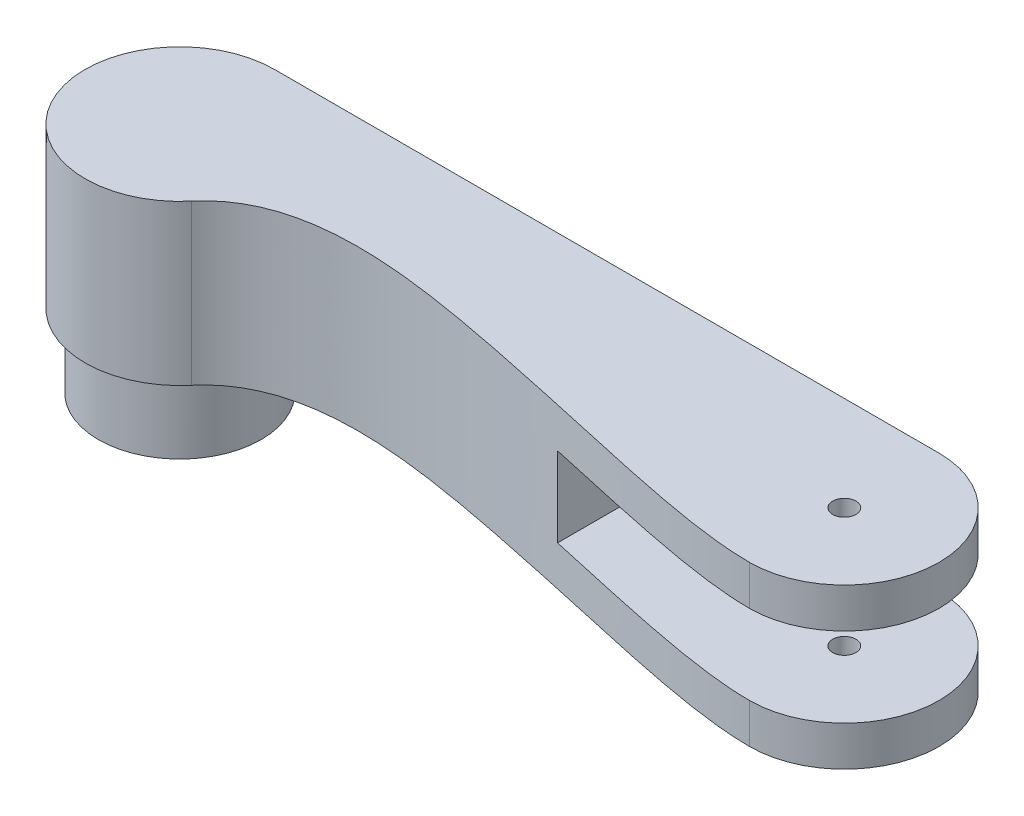
ISO-10303-21;
HEADER;
FILE_DESCRIPTION(('STEP AP214'),'2;1');
FILE_NAME('part.step','',(''),(''),'','','');
FILE_SCHEMA(('AUTOMOTIVE_DESIGN { 1 0 10303 214 1 1 1 1 }'));
ENDSEC;
DATA;
#1=APPLICATION_CONTEXT('core data for automotive mechanical design processes');
#2=APPLICATION_PROTOCOL_DEFINITION('international standard','automotive_design',2000,#1);
#3=PRODUCT_CONTEXT('',#1,'mechanical');
#4=PRODUCT('Part','Part','',(#3));
#5=PRODUCT_RELATED_PRODUCT_CATEGORY('part','',(#4));
#6=PRODUCT_DEFINITION_FORMATION('','',#4);
#7=PRODUCT_DEFINITION_CONTEXT('part definition',#1,'design');
#8=PRODUCT_DEFINITION('design','',#6,#7);
#9=PRODUCT_DEFINITION_SHAPE('','',#8);
#10=(LENGTH_UNIT() NAMED_UNIT(*) SI_UNIT(.MILLI.,.METRE.));
#11=(NAMED_UNIT(*) PLANE_ANGLE_UNIT() SI_UNIT($,.RADIAN.));
#12=(NAMED_UNIT(*) SI_UNIT($,.STERADIAN.) SOLID_ANGLE_UNIT());
#13=UNCERTAINTY_MEASURE_WITH_UNIT(LENGTH_MEASURE(1.E-05),#10,'distance_accuracy_value','');
#14=(GEOMETRIC_REPRESENTATION_CONTEXT(3) GLOBAL_UNCERTAINTY_ASSIGNED_CONTEXT((#13)) GLOBAL_UNIT_ASSIGNED_CONTEXT((#10,
#11,#12)) REPRESENTATION_CONTEXT('',''));
#15=CARTESIAN_POINT('',(0.,0.,0.));
#16=DIRECTION('',(0.,0.,1.));
#17=DIRECTION('',(1.,0.,0.));
#18=AXIS2_PLACEMENT_3D('',#15,#16,#17);
#19=CARTESIAN_POINT('',(-50.,6.,0.));
#20=DIRECTION('',(0.,1.,0.));
#21=DIRECTION('',(0.,0.,1.));
#22=AXIS2_PLACEMENT_3D('',#19,#20,#21);
#23=PLANE('',#22);
#24=CARTESIAN_POINT('',(50.,6.,0.));
#25=DIRECTION('',(0.,-1.,0.));
#26=DIRECTION('',(0.,0.,-1.));
#27=AXIS2_PLACEMENT_3D('',#24,#25,#26);
#28=CIRCLE('',#27,1.75);
#29=CARTESIAN_POINT('',(50.,6.,-1.75000000000002));
#30=VERTEX_POINT('',#29);
#31=EDGE_CURVE('E143',#30,#30,#28,.T.);
#32=ORIENTED_EDGE('',*,*,#31,.T.);
#33=EDGE_LOOP('',(#32));
#34=FACE_BOUND('',#33,.T.);
#35=DIRECTION('',(0.,0.,-1.));
#36=VECTOR('',#35,1.);
#37=CARTESIAN_POINT('',(15.,6.,-14.25));
#38=LINE('',#37,#36);
#39=CARTESIAN_POINT('',(15.,6.,8.15498555520889));
#40=VERTEX_POINT('',#39);
#41=CARTESIAN_POINT('',(15.,6.,-14.25));
#42=VERTEX_POINT('',#41);
#43=EDGE_CURVE('E85',#40,#42,#38,.T.);
#44=ORIENTED_EDGE('',*,*,#43,.F.);
#45=CARTESIAN_POINT('',(-39.0731568300049,6.,9.1469447543063));
#46=CARTESIAN_POINT('',(-31.5140940330976,6.,0.116968525897956));
#47=CARTESIAN_POINT('',(5.43865583696207,6.,4.64524054337758));
#48=CARTESIAN_POINT('',(38.6975143870053,6.,14.25));
#49=CARTESIAN_POINT('',(50.,6.,14.25));
#50=B_SPLINE_CURVE_WITH_KNOTS('',3,(#45,#46,#47,#48,#49),.UNSPECIFIED.,.F.,.F.,(4,1,4),(0.,
0.43590790251524,1.),.UNSPECIFIED.);
#51=CARTESIAN_POINT('',(50.,6.,14.25));
#52=VERTEX_POINT('',#51);
#53=EDGE_CURVE('E198',#52,#40,#50,.F.);
#54=ORIENTED_EDGE('',*,*,#53,.F.);
#55=CARTESIAN_POINT('',(50.,6.,0.));
#56=DIRECTION('',(0.,1.,0.));
#57=DIRECTION('',(0.,0.,1.));
#58=AXIS2_PLACEMENT_3D('',#55,#56,#57);
#59=CIRCLE('',#58,14.25);
#60=CARTESIAN_POINT('',(50.,6.,-14.25));
#61=VERTEX_POINT('',#60);
#62=EDGE_CURVE('E65',#52,#61,#59,.T.);
#63=ORIENTED_EDGE('',*,*,#62,.T.);
#64=DIRECTION('',(-1.,0.,0.));
#65=VECTOR('',#64,1.);
#66=CARTESIAN_POINT('',(-50.,6.,-14.25));
#67=LINE('',#66,#65);
#68=EDGE_CURVE('E150',#61,#42,#67,.T.);
#69=ORIENTED_EDGE('',*,*,#68,.T.);
#70=EDGE_LOOP('',(#44,#54,#63,#69));
#71=FACE_BOUND('',#70,.T.);
#72=ADVANCED_FACE('F41',(#34,#71),#23,.T.);
#73=CARTESIAN_POINT('',(-50.,0.,0.));
#74=DIRECTION('',(0.,1.,0.));
#75=DIRECTION('',(0.,0.,1.));
#76=AXIS2_PLACEMENT_3D('',#73,#74,#75);
#77=PLANE('',#76);
#78=CARTESIAN_POINT('',(-50.,0.,0.));
#79=DIRECTION('',(0.,1.,0.));
#80=DIRECTION('',(0.,0.,1.));
#81=AXIS2_PLACEMENT_3D('',#78,#79,#80);
#82=CIRCLE('',#81,12.25);
#83=CARTESIAN_POINT('',(-50.,0.,12.25));
#84=VERTEX_POINT('',#83);
#85=EDGE_CURVE('E11',#84,#84,#82,.F.);
#86=ORIENTED_EDGE('',*,*,#85,.F.);
#87=EDGE_LOOP('',(#86));
#88=FACE_BOUND('',#87,.T.);
#89=CARTESIAN_POINT('',(50.,0.,0.));
#90=DIRECTION('',(0.,-1.,0.));
#91=DIRECTION('',(0.,0.,-1.));
#92=AXIS2_PLACEMENT_3D('',#89,#90,#91);
#93=CIRCLE('',#92,1.75);
#94=CARTESIAN_POINT('',(50.,0.,-1.75000000000002));
#95=VERTEX_POINT('',#94);
#96=EDGE_CURVE('E188',#95,#95,#93,.T.);
#97=ORIENTED_EDGE('',*,*,#96,.F.);
#98=EDGE_LOOP('',(#97));
#99=FACE_BOUND('',#98,.T.);
#100=CARTESIAN_POINT('',(-39.0731568300049,0.,9.1469447543063));
#101=CARTESIAN_POINT('',(-31.5140940330976,0.,0.116968525897956));
#102=CARTESIAN_POINT('',(5.43865583696207,0.,4.64524054337758));
#103=CARTESIAN_POINT('',(38.6975143870053,0.,14.25));
#104=CARTESIAN_POINT('',(50.,0.,14.25));
#105=B_SPLINE_CURVE_WITH_KNOTS('',3,(#100,#101,#102,#103,#104),.UNSPECIFIED.,.F.,.F.,(4,1,4),
(0.,0.43590790251524,1.),.UNSPECIFIED.);
#106=CARTESIAN_POINT('',(50.,0.,14.25));
#107=VERTEX_POINT('',#106);
#108=CARTESIAN_POINT('',(-39.0731568300049,0.,9.1469447543063));
#109=VERTEX_POINT('',#108);
#110=EDGE_CURVE('E125',#107,#109,#105,.F.);
#111=ORIENTED_EDGE('',*,*,#110,.T.);
#112=CARTESIAN_POINT('',(-50.,0.,0.));
#113=DIRECTION('',(0.,1.,0.));
#114=DIRECTION('',(0.,0.,1.));
#115=AXIS2_PLACEMENT_3D('',#112,#113,#114);
#116=CIRCLE('',#115,14.25);
#117=CARTESIAN_POINT('',(-50.,0.,-14.25));
#118=VERTEX_POINT('',#117);
#119=EDGE_CURVE('E140',#118,#109,#116,.T.);
#120=ORIENTED_EDGE('',*,*,#119,.F.);
#121=DIRECTION('',(-1.,0.,0.));
#122=VECTOR('',#121,1.);
#123=CARTESIAN_POINT('',(-50.,0.,-14.25));
#124=LINE('',#123,#122);
#125=CARTESIAN_POINT('',(50.,0.,-14.25));
#126=VERTEX_POINT('',#125);
#127=EDGE_CURVE('E139',#126,#118,#124,.T.);
#128=ORIENTED_EDGE('',*,*,#127,.F.);
#129=CARTESIAN_POINT('',(50.,0.,0.));
#130=DIRECTION('',(0.,1.,0.));
#131=DIRECTION('',(0.,0.,1.));
#132=AXIS2_PLACEMENT_3D('',#129,#130,#131);
#133=CIRCLE('',#132,14.25);
#134=EDGE_CURVE('E77',#107,#126,#133,.T.);
#135=ORIENTED_EDGE('',*,*,#134,.F.);
#136=EDGE_LOOP('',(#111,#120,#128,#135));
#137=FACE_BOUND('',#136,.T.);
#138=ADVANCED_FACE('F138',(#88,#99,#137),#77,.F.);
#139=CARTESIAN_POINT('',(15.,18.,-14.25));
#140=DIRECTION('',(-1.,0.,0.));
#141=DIRECTION('',(0.,0.,1.));
#142=AXIS2_PLACEMENT_3D('',#139,#140,#141);
#143=PLANE('',#142);
#144=DIRECTION('',(0.,1.,0.));
#145=VECTOR('',#144,1.);
#146=CARTESIAN_POINT('',(15.,-0.000999999999997531,8.15498555520889));
#147=LINE('',#146,#145);
#148=CARTESIAN_POINT('',(15.0000000058143,18.,8.15498555648991));
#149=VERTEX_POINT('',#148);
#150=EDGE_CURVE('E197',#149,#40,#147,.F.);
#151=ORIENTED_EDGE('',*,*,#150,.T.);
#152=ORIENTED_EDGE('',*,*,#43,.T.);
#153=DIRECTION('',(0.,-1.,0.));
#154=VECTOR('',#153,1.);
#155=CARTESIAN_POINT('',(15.,18.,-14.25));
#156=LINE('',#155,#154);
#157=CARTESIAN_POINT('',(15.,18.,-14.25));
#158=VERTEX_POINT('',#157);
#159=EDGE_CURVE('E184',#158,#42,#156,.T.);
#160=ORIENTED_EDGE('',*,*,#159,.F.);
#161=DIRECTION('',(0.,0.,-1.));
#162=VECTOR('',#161,1.);
#163=CARTESIAN_POINT('',(15.,18.,-14.25));
#164=LINE('',#163,#162);
#165=EDGE_CURVE('E92',#149,#158,#164,.T.);
#166=ORIENTED_EDGE('',*,*,#165,.F.);
#167=EDGE_LOOP('',(#151,#152,#160,#166));
#168=FACE_BOUND('',#167,.T.);
#169=ADVANCED_FACE('F196',(#168),#143,.F.);
#170=CARTESIAN_POINT('',(-50.,18.,0.));
#171=DIRECTION('',(0.,1.,0.));
#172=DIRECTION('',(0.,0.,1.));
#173=AXIS2_PLACEMENT_3D('',#170,#171,#172);
#174=PLANE('',#173);
#175=CARTESIAN_POINT('',(50.,18.,0.));
#176=DIRECTION('',(0.,1.,0.));
#177=DIRECTION('',(0.,0.,1.));
#178=AXIS2_PLACEMENT_3D('',#175,#176,#177);
#179=CIRCLE('',#178,1.75);
#180=CARTESIAN_POINT('',(50.,18.,1.74999999999999));
#181=VERTEX_POINT('',#180);
#182=EDGE_CURVE('E160',#181,#181,#179,.F.);
#183=ORIENTED_EDGE('',*,*,#182,.F.);
#184=EDGE_LOOP('',(#183));
#185=FACE_BOUND('',#184,.T.);
#186=CARTESIAN_POINT('',(-39.0731568300049,18.,9.1469447543063));
#187=CARTESIAN_POINT('',(-31.5140940330976,18.,0.116968525897956));
#188=CARTESIAN_POINT('',(5.43865583696207,18.,4.64524054337758));
#189=CARTESIAN_POINT('',(38.6975143870053,18.,14.25));
#190=CARTESIAN_POINT('',(50.,18.,14.25));
#191=B_SPLINE_CURVE_WITH_KNOTS('',3,(#186,#187,#188,#189,#190),.UNSPECIFIED.,.F.,.F.,(4,1,4),
(0.,0.43590790251524,1.),.UNSPECIFIED.);
#192=CARTESIAN_POINT('',(50.,18.,14.25));
#193=VERTEX_POINT('',#192);
#194=EDGE_CURVE('E131',#193,#149,#191,.F.);
#195=ORIENTED_EDGE('',*,*,#194,.T.);
#196=ORIENTED_EDGE('',*,*,#165,.T.);
#197=DIRECTION('',(-1.,0.,0.));
#198=VECTOR('',#197,1.);
#199=CARTESIAN_POINT('',(-50.,18.,-14.25));
#200=LINE('',#199,#198);
#201=CARTESIAN_POINT('',(50.,18.,-14.25));
#202=VERTEX_POINT('',#201);
#203=EDGE_CURVE('E159',#202,#158,#200,.T.);
#204=ORIENTED_EDGE('',*,*,#203,.F.);
#205=CARTESIAN_POINT('',(50.,18.,0.));
#206=DIRECTION('',(0.,1.,0.));
#207=DIRECTION('',(0.,0.,1.));
#208=AXIS2_PLACEMENT_3D('',#205,#206,#207);
#209=CIRCLE('',#208,14.25);
#210=EDGE_CURVE('E158',#193,#202,#209,.T.);
#211=ORIENTED_EDGE('',*,*,#210,.F.);
#212=EDGE_LOOP('',(#195,#196,#204,#211));
#213=FACE_BOUND('',#212,.T.);
#214=ADVANCED_FACE('F236',(#185,#213),#174,.F.);
#215=CARTESIAN_POINT('',(-50.,24.,0.));
#216=DIRECTION('',(0.,1.,0.));
#217=DIRECTION('',(0.,0.,1.));
#218=AXIS2_PLACEMENT_3D('',#215,#216,#217);
#219=PLANE('',#218);
#220=CARTESIAN_POINT('',(50.,24.,0.));
#221=DIRECTION('',(0.,1.,0.));
#222=DIRECTION('',(0.,0.,1.));
#223=AXIS2_PLACEMENT_3D('',#220,#221,#222);
#224=CIRCLE('',#223,1.75);
#225=CARTESIAN_POINT('',(50.,24.,1.74999999999999));
#226=VERTEX_POINT('',#225);
#227=EDGE_CURVE('E169',#226,#226,#224,.T.);
#228=ORIENTED_EDGE('',*,*,#227,.F.);
#229=EDGE_LOOP('',(#228));
#230=FACE_BOUND('',#229,.T.);
#231=CARTESIAN_POINT('',(-50.,24.,0.));
#232=DIRECTION('',(0.,1.,0.));
#233=DIRECTION('',(0.,0.,1.));
#234=AXIS2_PLACEMENT_3D('',#231,#232,#233);
#235=CIRCLE('',#234,14.25);
#236=CARTESIAN_POINT('',(-50.,24.,-14.25));
#237=VERTEX_POINT('',#236);
#238=CARTESIAN_POINT('',(-39.0731568300049,24.,9.1469447543063));
#239=VERTEX_POINT('',#238);
#240=EDGE_CURVE('E56',#237,#239,#235,.T.);
#241=ORIENTED_EDGE('',*,*,#240,.T.);
#242=CARTESIAN_POINT('',(-39.0731568300049,24.,9.1469447543063));
#243=CARTESIAN_POINT('',(-31.5140940330976,24.,0.116968525897956));
#244=CARTESIAN_POINT('',(5.43865583696207,24.,4.64524054337758));
#245=CARTESIAN_POINT('',(38.6975143870053,24.,14.25));
#246=CARTESIAN_POINT('',(50.,24.,14.25));
#247=B_SPLINE_CURVE_WITH_KNOTS('',3,(#242,#243,#244,#245,#246),.UNSPECIFIED.,.F.,.F.,(4,1,4),
(0.,0.43590790251524,1.),.UNSPECIFIED.);
#248=CARTESIAN_POINT('',(50.,24.,14.25));
#249=VERTEX_POINT('',#248);
#250=EDGE_CURVE('E200',#239,#249,#247,.T.);
#251=ORIENTED_EDGE('',*,*,#250,.T.);
#252=CARTESIAN_POINT('',(50.,24.,0.));
#253=DIRECTION('',(0.,1.,0.));
#254=DIRECTION('',(0.,0.,1.));
#255=AXIS2_PLACEMENT_3D('',#252,#253,#254);
#256=CIRCLE('',#255,14.25);
#257=CARTESIAN_POINT('',(50.,24.,-14.25));
#258=VERTEX_POINT('',#257);
#259=EDGE_CURVE('E178',#249,#258,#256,.T.);
#260=ORIENTED_EDGE('',*,*,#259,.T.);
#261=DIRECTION('',(-1.,0.,0.));
#262=VECTOR('',#261,1.);
#263=CARTESIAN_POINT('',(-50.,24.,-14.25));
#264=LINE('',#263,#262);
#265=EDGE_CURVE('E180',#258,#237,#264,.T.);
#266=ORIENTED_EDGE('',*,*,#265,.T.);
#267=EDGE_LOOP('',(#241,#251,#260,#266));
#268=FACE_BOUND('',#267,.T.);
#269=ADVANCED_FACE('F233',(#230,#268),#219,.T.);
#270=CARTESIAN_POINT('',(-50.,6.,0.));
#271=DIRECTION('',(0.,-1.,0.));
#272=DIRECTION('',(0.,0.,-1.));
#273=AXIS2_PLACEMENT_3D('',#270,#271,#272);
#274=CYLINDRICAL_SURFACE('',#273,14.25);
#275=ORIENTED_EDGE('',*,*,#119,.T.);
#276=DIRECTION('',(0.,1.,0.));
#277=VECTOR('',#276,1.);
#278=CARTESIAN_POINT('',(-39.0731568300049,-0.001000000000001,9.1469447543063));
#279=LINE('',#278,#277);
#280=EDGE_CURVE('E128',#109,#239,#279,.T.);
#281=ORIENTED_EDGE('',*,*,#280,.T.);
#282=ORIENTED_EDGE('',*,*,#240,.F.);
#283=DIRECTION('',(0.,-1.,0.));
#284=VECTOR('',#283,1.);
#285=CARTESIAN_POINT('',(-50.,6.,-14.25));
#286=LINE('',#285,#284);
#287=EDGE_CURVE('E147',#237,#118,#286,.T.);
#288=ORIENTED_EDGE('',*,*,#287,.T.);
#289=EDGE_LOOP('',(#275,#281,#282,#288));
#290=FACE_BOUND('',#289,.T.);
#291=ADVANCED_FACE('F43',(#290),#274,.T.);
#292=CARTESIAN_POINT('',(50.,6.,0.));
#293=DIRECTION('',(0.,-1.,0.));
#294=DIRECTION('',(0.,0.,-1.));
#295=AXIS2_PLACEMENT_3D('',#292,#293,#294);
#296=CYLINDRICAL_SURFACE('',#295,14.25);
#297=ORIENTED_EDGE('',*,*,#134,.T.);
#298=DIRECTION('',(0.,-1.,0.));
#299=VECTOR('',#298,1.);
#300=CARTESIAN_POINT('',(50.,6.,-14.25));
#301=LINE('',#300,#299);
#302=EDGE_CURVE('E135',#61,#126,#301,.T.);
#303=ORIENTED_EDGE('',*,*,#302,.F.);
#304=ORIENTED_EDGE('',*,*,#62,.F.);
#305=DIRECTION('',(0.,-1.,0.));
#306=VECTOR('',#305,1.);
#307=CARTESIAN_POINT('',(50.,6.,14.25));
#308=LINE('',#307,#306);
#309=EDGE_CURVE('E49',#52,#107,#308,.T.);
#310=ORIENTED_EDGE('',*,*,#309,.T.);
#311=EDGE_LOOP('',(#297,#303,#304,#310));
#312=FACE_BOUND('',#311,.T.);
#313=ADVANCED_FACE('F134',(#312),#296,.T.);
#314=CARTESIAN_POINT('',(-50.,6.,-14.25));
#315=DIRECTION('',(0.,0.,1.));
#316=DIRECTION('',(1.,0.,0.));
#317=AXIS2_PLACEMENT_3D('',#314,#315,#316);
#318=PLANE('',#317);
#319=ORIENTED_EDGE('',*,*,#127,.T.);
#320=ORIENTED_EDGE('',*,*,#287,.F.);
#321=ORIENTED_EDGE('',*,*,#265,.F.);
#322=DIRECTION('',(0.,-1.,0.));
#323=VECTOR('',#322,1.);
#324=CARTESIAN_POINT('',(50.,24.,-14.25));
#325=LINE('',#324,#323);
#326=EDGE_CURVE('E155',#258,#202,#325,.T.);
#327=ORIENTED_EDGE('',*,*,#326,.T.);
#328=ORIENTED_EDGE('',*,*,#203,.T.);
#329=ORIENTED_EDGE('',*,*,#159,.T.);
#330=ORIENTED_EDGE('',*,*,#68,.F.);
#331=ORIENTED_EDGE('',*,*,#302,.T.);
#332=EDGE_LOOP('',(#319,#320,#321,#327,#328,#329,#330,#331));
#333=FACE_BOUND('',#332,.T.);
#334=ADVANCED_FACE('F195',(#333),#318,.F.);
#335=CARTESIAN_POINT('',(50.,6.,0.));
#336=DIRECTION('',(0.,-1.,0.));
#337=DIRECTION('',(0.,0.,-1.));
#338=AXIS2_PLACEMENT_3D('',#335,#336,#337);
#339=CYLINDRICAL_SURFACE('',#338,1.75);
#340=ORIENTED_EDGE('',*,*,#31,.F.);
#341=EDGE_LOOP('',(#340));
#342=FACE_BOUND('',#341,.T.);
#343=ORIENTED_EDGE('',*,*,#96,.T.);
#344=EDGE_LOOP('',(#343));
#345=FACE_BOUND('',#344,.T.);
#346=ADVANCED_FACE('F243',(#342,#345),#339,.F.);
#347=CARTESIAN_POINT('',(50.,24.,0.));
#348=DIRECTION('',(0.,-1.,0.));
#349=DIRECTION('',(0.,0.,-1.));
#350=AXIS2_PLACEMENT_3D('',#347,#348,#349);
#351=CYLINDRICAL_SURFACE('',#350,14.25);
#352=ORIENTED_EDGE('',*,*,#210,.T.);
#353=ORIENTED_EDGE('',*,*,#326,.F.);
#354=ORIENTED_EDGE('',*,*,#259,.F.);
#355=DIRECTION('',(0.,-1.,0.));
#356=VECTOR('',#355,1.);
#357=CARTESIAN_POINT('',(50.,24.,14.25));
#358=LINE('',#357,#356);
#359=EDGE_CURVE('E152',#249,#193,#358,.T.);
#360=ORIENTED_EDGE('',*,*,#359,.T.);
#361=EDGE_LOOP('',(#352,#353,#354,#360));
#362=FACE_BOUND('',#361,.T.);
#363=ADVANCED_FACE('F231',(#362),#351,.T.);
#364=CARTESIAN_POINT('',(50.,-0.001000000000001,0.));
#365=DIRECTION('',(0.,1.,0.));
#366=DIRECTION('',(0.,0.,1.));
#367=AXIS2_PLACEMENT_3D('',#364,#365,#366);
#368=CYLINDRICAL_SURFACE('',#367,1.75);
#369=CARTESIAN_POINT('',(50.,24.,1.74999999999999));
#370=CARTESIAN_POINT('',(50.,23.9375,1.74999999999999));
#371=CARTESIAN_POINT('',(50.,23.875,1.74999999999999));
#372=CARTESIAN_POINT('',(50.,23.75,1.74999999999999));
#373=CARTESIAN_POINT('',(50.,23.6875,1.74999999999999));
#374=CARTESIAN_POINT('',(50.,23.5625,1.74999999999999));
#375=CARTESIAN_POINT('',(50.,23.5,1.74999999999999));
#376=CARTESIAN_POINT('',(50.,23.375,1.74999999999999));
#377=CARTESIAN_POINT('',(50.,23.3125,1.74999999999999));
#378=CARTESIAN_POINT('',(50.,23.1875,1.74999999999999));
#379=CARTESIAN_POINT('',(50.,23.125,1.74999999999999));
#380=CARTESIAN_POINT('',(50.,23.,1.74999999999999));
#381=CARTESIAN_POINT('',(50.,22.9375,1.74999999999999));
#382=CARTESIAN_POINT('',(50.,22.8125,1.74999999999999));
#383=CARTESIAN_POINT('',(50.,22.75,1.74999999999999));
#384=CARTESIAN_POINT('',(50.,22.625,1.74999999999999));
#385=CARTESIAN_POINT('',(50.,22.5625,1.74999999999999));
#386=CARTESIAN_POINT('',(50.,22.4375,1.74999999999999));
#387=CARTESIAN_POINT('',(50.,22.375,1.74999999999999));
#388=CARTESIAN_POINT('',(50.,22.25,1.74999999999999));
#389=CARTESIAN_POINT('',(50.,22.1875,1.74999999999999));
#390=CARTESIAN_POINT('',(50.,22.0625,1.74999999999999));
#391=CARTESIAN_POINT('',(50.,22.,1.74999999999999));
#392=CARTESIAN_POINT('',(50.,21.875,1.74999999999999));
#393=CARTESIAN_POINT('',(50.,21.8125,1.74999999999999));
#394=CARTESIAN_POINT('',(50.,21.6875,1.74999999999999));
#395=CARTESIAN_POINT('',(50.,21.625,1.74999999999999));
#396=CARTESIAN_POINT('',(50.,21.5,1.74999999999999));
#397=CARTESIAN_POINT('',(50.,21.4375,1.74999999999999));
#398=CARTESIAN_POINT('',(50.,21.3125,1.74999999999999));
#399=CARTESIAN_POINT('',(50.,21.25,1.74999999999999));
#400=CARTESIAN_POINT('',(50.,21.125,1.74999999999999));
#401=CARTESIAN_POINT('',(50.,21.0625,1.74999999999999));
#402=CARTESIAN_POINT('',(50.,20.9375,1.74999999999999));
#403=CARTESIAN_POINT('',(50.,20.875,1.74999999999999));
#404=CARTESIAN_POINT('',(50.,20.75,1.74999999999999));
#405=CARTESIAN_POINT('',(50.,20.6875,1.74999999999999));
#406=CARTESIAN_POINT('',(50.,20.5625,1.74999999999999));
#407=CARTESIAN_POINT('',(50.,20.5,1.74999999999999));
#408=CARTESIAN_POINT('',(50.,20.375,1.74999999999999));
#409=CARTESIAN_POINT('',(50.,20.3125,1.74999999999999));
#410=CARTESIAN_POINT('',(50.,20.1875,1.74999999999999));
#411=CARTESIAN_POINT('',(50.,20.125,1.74999999999999));
#412=CARTESIAN_POINT('',(50.,20.,1.74999999999999));
#413=CARTESIAN_POINT('',(50.,19.9375,1.74999999999999));
#414=CARTESIAN_POINT('',(50.,19.8125,1.74999999999999));
#415=CARTESIAN_POINT('',(50.,19.75,1.74999999999999));
#416=CARTESIAN_POINT('',(50.,19.625,1.74999999999999));
#417=CARTESIAN_POINT('',(50.,19.5625,1.74999999999999));
#418=CARTESIAN_POINT('',(50.,19.4375,1.74999999999999));
#419=CARTESIAN_POINT('',(50.,19.375,1.74999999999999));
#420=CARTESIAN_POINT('',(50.,19.25,1.74999999999999));
#421=CARTESIAN_POINT('',(50.,19.1875,1.74999999999999));
#422=CARTESIAN_POINT('',(50.,19.0625,1.74999999999999));
#423=CARTESIAN_POINT('',(50.,19.,1.74999999999999));
#424=CARTESIAN_POINT('',(50.,18.875,1.74999999999999));
#425=CARTESIAN_POINT('',(50.,18.8125,1.74999999999999));
#426=CARTESIAN_POINT('',(50.,18.6875,1.74999999999999));
#427=CARTESIAN_POINT('',(50.,18.625,1.74999999999999));
#428=CARTESIAN_POINT('',(50.,18.5,1.74999999999999));
#429=CARTESIAN_POINT('',(50.,18.4375,1.74999999999999));
#430=CARTESIAN_POINT('',(50.,18.3125,1.74999999999999));
#431=CARTESIAN_POINT('',(50.,18.25,1.74999999999999));
#432=CARTESIAN_POINT('',(50.,18.125,1.74999999999999));
#433=CARTESIAN_POINT('',(50.,18.0625,1.74999999999999));
#434=CARTESIAN_POINT('',(50.,18.,1.74999999999999));
#435=B_SPLINE_CURVE_WITH_KNOTS('',3,(#369,#370,#371,#372,#373,#374,#375,#376,#377,#378,#379,
#380,#381,#382,#383,#384,#385,#386,#387,#388,#389,#390,#391,#392,#393,#394,#395,#396,#397,#398,
#399,#400,#401,#402,#403,#404,#405,#406,#407,#408,#409,#410,#411,#412,#413,#414,#415,#416,#417,
#418,#419,#420,#421,#422,#423,#424,#425,#426,#427,#428,#429,#430,#431,#432,#433,#434),
.UNSPECIFIED.,.F.,.F.,(4,2,2,2,2,2,2,2,2,2,2,2,2,2,2,2,2,2,2,2,2,2,2,2,2,2,2,2,2,2,2,2,4),(0.,
0.1875,0.375,0.5625,0.750000000000001,0.937500000000001,1.125,1.3125,1.5,1.6875,1.875,2.0625,
2.25,2.4375,2.625,2.8125,3.,3.1875,3.375,3.5625,3.75,3.9375,4.125,4.3125,4.5,4.6875,4.875,
5.0625,5.25,5.4375,5.625,5.8125,6.),.UNSPECIFIED.);
#436=EDGE_CURVE('BSEAM227',#226,#181,#435,.T.);
#437=ORIENTED_EDGE('',*,*,#227,.T.);
#438=ORIENTED_EDGE('',*,*,#182,.T.);
#439=ORIENTED_EDGE('',*,*,#436,.T.);
#440=ORIENTED_EDGE('',*,*,#436,.F.);
#441=EDGE_LOOP('',(#437,#439,#438,#440));
#442=FACE_BOUND('',#441,.T.);
#443=ADVANCED_FACE('F227',(#442),#368,.F.);
#444=CARTESIAN_POINT('',(-39.0731568300049,-0.000999999999997531,9.1469447543063));
#445=CARTESIAN_POINT('',(-31.5140940330976,-0.000999999999997531,0.116968525897956));
#446=CARTESIAN_POINT('',(5.43865583696207,-0.000999999999997531,4.64524054337758));
#447=CARTESIAN_POINT('',(38.6975143870053,-0.000999999999997531,14.25));
#448=CARTESIAN_POINT('',(50.,-0.000999999999997531,14.25));
#449=B_SPLINE_CURVE_WITH_KNOTS('',3,(#444,#445,#446,#447,#448),.UNSPECIFIED.,.F.,.F.,(4,1,4),
(0.,0.43590790251524,1.),.UNSPECIFIED.);
#450=DIRECTION('',(0.,1.,0.));
#451=VECTOR('',#450,1.);
#452=SURFACE_OF_LINEAR_EXTRUSION('',#449,#451);
#453=ORIENTED_EDGE('',*,*,#309,.F.);
#454=ORIENTED_EDGE('',*,*,#53,.T.);
#455=ORIENTED_EDGE('',*,*,#150,.F.);
#456=ORIENTED_EDGE('',*,*,#194,.F.);
#457=ORIENTED_EDGE('',*,*,#359,.F.);
#458=ORIENTED_EDGE('',*,*,#250,.F.);
#459=ORIENTED_EDGE('',*,*,#280,.F.);
#460=ORIENTED_EDGE('',*,*,#110,.F.);
#461=EDGE_LOOP('',(#453,#454,#455,#456,#457,#458,#459,#460));
#462=FACE_BOUND('',#461,.T.);
#463=ADVANCED_FACE('F126',(#462),#452,.T.);
#464=CARTESIAN_POINT('',(-50.,-11.,0.));
#465=DIRECTION('',(0.,1.,0.));
#466=DIRECTION('',(0.,0.,1.));
#467=AXIS2_PLACEMENT_3D('',#464,#465,#466);
#468=CYLINDRICAL_SURFACE('',#467,12.25);
#469=CARTESIAN_POINT('',(-50.,-11.,0.));
#470=DIRECTION('',(0.,-1.,0.));
#471=DIRECTION('',(0.,0.,-1.));
#472=AXIS2_PLACEMENT_3D('',#469,#470,#471);
#473=CIRCLE('',#472,12.25);
#474=CARTESIAN_POINT('',(-50.,-11.,-12.25));
#475=VERTEX_POINT('',#474);
#476=EDGE_CURVE('E132',#475,#475,#473,.T.);
#477=ORIENTED_EDGE('',*,*,#476,.F.);
#478=EDGE_LOOP('',(#477));
#479=FACE_BOUND('',#478,.T.);
#480=ORIENTED_EDGE('',*,*,#85,.T.);
#481=EDGE_LOOP('',(#480));
#482=FACE_BOUND('',#481,.T.);
#483=ADVANCED_FACE('F226',(#479,#482),#468,.T.);
#484=CARTESIAN_POINT('',(-50.,-11.,0.));
#485=DIRECTION('',(0.,-1.,0.));
#486=DIRECTION('',(0.,0.,-1.));
#487=AXIS2_PLACEMENT_3D('',#484,#485,#486);
#488=PLANE('',#487);
#489=CARTESIAN_POINT('',(-50.,-11.,6.75));
#490=DIRECTION('',(0.,-1.,0.));
#491=DIRECTION('',(0.,0.,-1.));
#492=AXIS2_PLACEMENT_3D('',#489,#490,#491);
#493=CIRCLE('',#492,2.55);
#494=CARTESIAN_POINT('',(-50.,-11.,4.2));
#495=VERTEX_POINT('',#494);
#496=EDGE_CURVE('E418',#495,#495,#493,.T.);
#497=ORIENTED_EDGE('',*,*,#496,.F.);
#498=EDGE_LOOP('',(#497));
#499=FACE_BOUND('',#498,.T.);
#500=CARTESIAN_POINT('',(-50.,-11.,-6.75));
#501=DIRECTION('',(0.,-1.,0.));
#502=DIRECTION('',(0.,0.,-1.));
#503=AXIS2_PLACEMENT_3D('',#500,#501,#502);
#504=CIRCLE('',#503,2.55);
#505=CARTESIAN_POINT('',(-50.,-11.,-9.3));
#506=VERTEX_POINT('',#505);
#507=EDGE_CURVE('E423',#506,#506,#504,.T.);
#508=ORIENTED_EDGE('',*,*,#507,.F.);
#509=EDGE_LOOP('',(#508));
#510=FACE_BOUND('',#509,.T.);
#511=CARTESIAN_POINT('',(-50.,-11.,0.));
#512=DIRECTION('',(0.,-1.,0.));
#513=DIRECTION('',(0.,0.,-1.));
#514=AXIS2_PLACEMENT_3D('',#511,#512,#513);
#515=CIRCLE('',#514,3.);
#516=CARTESIAN_POINT('',(-50.,-11.,-3.));
#517=VERTEX_POINT('',#516);
#518=EDGE_CURVE('E431',#517,#517,#515,.T.);
#519=ORIENTED_EDGE('',*,*,#518,.F.);
#520=EDGE_LOOP('',(#519));
#521=FACE_BOUND('',#520,.T.);
#522=ORIENTED_EDGE('',*,*,#476,.T.);
#523=EDGE_LOOP('',(#522));
#524=FACE_BOUND('',#523,.T.);
#525=ADVANCED_FACE('F341',(#499,#510,#521,#524),#488,.T.);
#526=CARTESIAN_POINT('',(-50.,-5.,0.));
#527=DIRECTION('',(0.,-1.,0.));
#528=DIRECTION('',(0.,0.,-1.));
#529=AXIS2_PLACEMENT_3D('',#526,#527,#528);
#530=CYLINDRICAL_SURFACE('',#529,3.);
#531=CARTESIAN_POINT('',(-50.,-5.,0.));
#532=DIRECTION('',(0.,-1.,0.));
#533=DIRECTION('',(0.,0.,-1.));
#534=AXIS2_PLACEMENT_3D('',#531,#532,#533);
#535=CIRCLE('',#534,3.);
#536=CARTESIAN_POINT('',(-50.,-5.,-3.));
#537=VERTEX_POINT('',#536);
#538=EDGE_CURVE('E434',#537,#537,#535,.T.);
#539=ORIENTED_EDGE('',*,*,#538,.F.);
#540=EDGE_LOOP('',(#539));
#541=FACE_BOUND('',#540,.T.);
#542=ORIENTED_EDGE('',*,*,#518,.T.);
#543=EDGE_LOOP('',(#542));
#544=FACE_BOUND('',#543,.T.);
#545=ADVANCED_FACE('F349',(#541,#544),#530,.F.);
#546=CARTESIAN_POINT('',(-50.,-5.,0.));
#547=DIRECTION('',(0.,-1.,0.));
#548=DIRECTION('',(0.,0.,-1.));
#549=AXIS2_PLACEMENT_3D('',#546,#547,#548);
#550=PLANE('',#549);
#551=ORIENTED_EDGE('',*,*,#538,.T.);
#552=EDGE_LOOP('',(#551));
#553=FACE_BOUND('',#552,.T.);
#554=ADVANCED_FACE('F357',(#553),#550,.T.);
#555=CARTESIAN_POINT('',(-50.,-5.,-6.75));
#556=DIRECTION('',(0.,-1.,0.));
#557=DIRECTION('',(0.,0.,-1.));
#558=AXIS2_PLACEMENT_3D('',#555,#556,#557);
#559=CYLINDRICAL_SURFACE('',#558,2.55);
#560=CARTESIAN_POINT('',(-50.,-5.,-6.75));
#561=DIRECTION('',(0.,-1.,0.));
#562=DIRECTION('',(0.,0.,-1.));
#563=AXIS2_PLACEMENT_3D('',#560,#561,#562);
#564=CIRCLE('',#563,2.55);
#565=CARTESIAN_POINT('',(-50.,-5.,-9.3));
#566=VERTEX_POINT('',#565);
#567=EDGE_CURVE('E428',#566,#566,#564,.T.);
#568=ORIENTED_EDGE('',*,*,#567,.F.);
#569=EDGE_LOOP('',(#568));
#570=FACE_BOUND('',#569,.T.);
#571=ORIENTED_EDGE('',*,*,#507,.T.);
#572=EDGE_LOOP('',(#571));
#573=FACE_BOUND('',#572,.T.);
#574=ADVANCED_FACE('F366',(#570,#573),#559,.F.);
#575=CARTESIAN_POINT('',(-50.,-5.,-6.75));
#576=DIRECTION('',(0.,-1.,0.));
#577=DIRECTION('',(0.,0.,-1.));
#578=AXIS2_PLACEMENT_3D('',#575,#576,#577);
#579=PLANE('',#578);
#580=ORIENTED_EDGE('',*,*,#567,.T.);
#581=EDGE_LOOP('',(#580));
#582=FACE_BOUND('',#581,.T.);
#583=ADVANCED_FACE('F375',(#582),#579,.T.);
#584=CARTESIAN_POINT('',(-50.,-5.,6.75));
#585=DIRECTION('',(0.,-1.,0.));
#586=DIRECTION('',(0.,0.,-1.));
#587=AXIS2_PLACEMENT_3D('',#584,#585,#586);
#588=CYLINDRICAL_SURFACE('',#587,2.55);
#589=CARTESIAN_POINT('',(-50.,-5.,6.75));
#590=DIRECTION('',(0.,-1.,0.));
#591=DIRECTION('',(0.,0.,-1.));
#592=AXIS2_PLACEMENT_3D('',#589,#590,#591);
#593=CIRCLE('',#592,2.55);
#594=CARTESIAN_POINT('',(-50.,-5.,4.2));
#595=VERTEX_POINT('',#594);
#596=EDGE_CURVE('E417',#595,#595,#593,.T.);
#597=ORIENTED_EDGE('',*,*,#596,.F.);
#598=EDGE_LOOP('',(#597));
#599=FACE_BOUND('',#598,.T.);
#600=ORIENTED_EDGE('',*,*,#496,.T.);
#601=EDGE_LOOP('',(#600));
#602=FACE_BOUND('',#601,.T.);
#603=ADVANCED_FACE('F384',(#599,#602),#588,.F.);
#604=CARTESIAN_POINT('',(-50.,-5.,6.75));
#605=DIRECTION('',(0.,-1.,0.));
#606=DIRECTION('',(0.,0.,-1.));
#607=AXIS2_PLACEMENT_3D('',#604,#605,#606);
#608=PLANE('',#607);
#609=ORIENTED_EDGE('',*,*,#596,.T.);
#610=EDGE_LOOP('',(#609));
#611=FACE_BOUND('',#610,.T.);
#612=ADVANCED_FACE('F393',(#611),#608,.T.);
#613=CLOSED_SHELL('',(#72,#138,#169,#214,#269,#291,#313,#334,#346,#363,#443,#463,#483,#525,#545,
#554,#574,#583,#603,#612));
#614=MANIFOLD_SOLID_BREP('B2',#613);
#615=ADVANCED_BREP_SHAPE_REPRESENTATION('',(#18,#614),#14);
#616=SHAPE_DEFINITION_REPRESENTATION(#9,#615);
ENDSEC;
END-ISO-10303-21;
